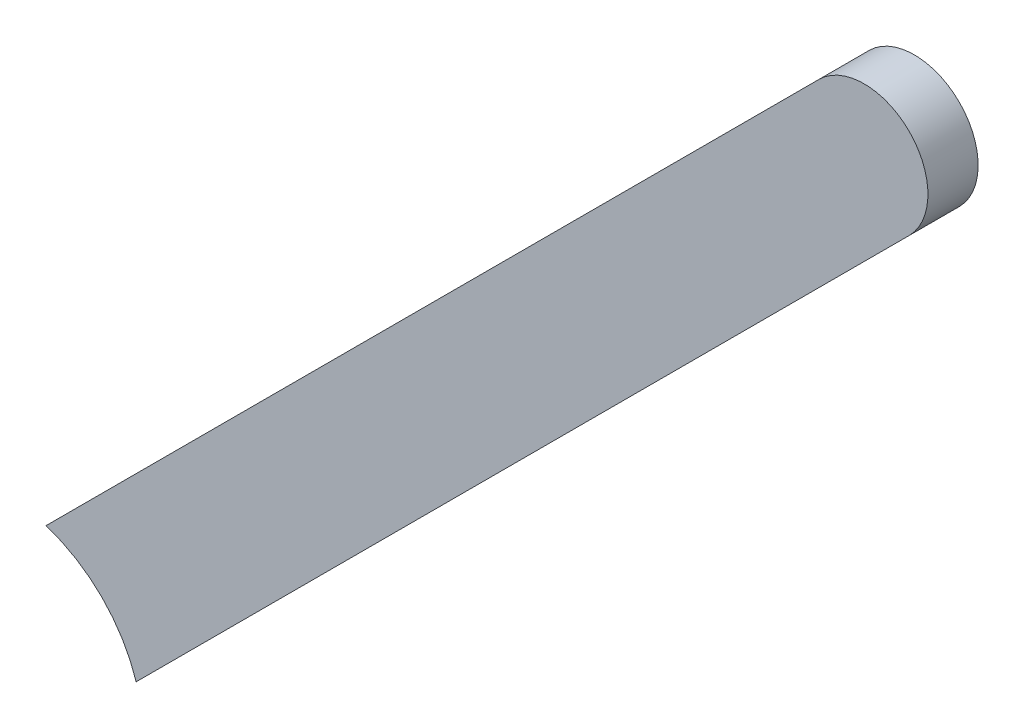
ISO-10303-21;
HEADER;
FILE_DESCRIPTION(('STEP AP214'),'2;1');
FILE_NAME('part.step','',(''),(''),'','','');
FILE_SCHEMA(('AUTOMOTIVE_DESIGN { 1 0 10303 214 1 1 1 1 }'));
ENDSEC;
DATA;
#1=APPLICATION_CONTEXT('core data for automotive mechanical design processes');
#2=APPLICATION_PROTOCOL_DEFINITION('international standard','automotive_design',2000,#1);
#3=PRODUCT_CONTEXT('',#1,'mechanical');
#4=PRODUCT('Part','Part','',(#3));
#5=PRODUCT_RELATED_PRODUCT_CATEGORY('part','',(#4));
#6=PRODUCT_DEFINITION_FORMATION('','',#4);
#7=PRODUCT_DEFINITION_CONTEXT('part definition',#1,'design');
#8=PRODUCT_DEFINITION('design','',#6,#7);
#9=PRODUCT_DEFINITION_SHAPE('','',#8);
#10=(LENGTH_UNIT() NAMED_UNIT(*) SI_UNIT(.MILLI.,.METRE.));
#11=(NAMED_UNIT(*) PLANE_ANGLE_UNIT() SI_UNIT($,.RADIAN.));
#12=(NAMED_UNIT(*) SI_UNIT($,.STERADIAN.) SOLID_ANGLE_UNIT());
#13=UNCERTAINTY_MEASURE_WITH_UNIT(LENGTH_MEASURE(1.E-05),#10,'distance_accuracy_value','');
#14=(GEOMETRIC_REPRESENTATION_CONTEXT(3) GLOBAL_UNCERTAINTY_ASSIGNED_CONTEXT((#13)) GLOBAL_UNIT_ASSIGNED_CONTEXT((#10,
#11,#12)) REPRESENTATION_CONTEXT('',''));
#15=CARTESIAN_POINT('',(0.,0.,0.));
#16=DIRECTION('',(0.,0.,1.));
#17=DIRECTION('',(1.,0.,0.));
#18=AXIS2_PLACEMENT_3D('',#15,#16,#17);
#19=CARTESIAN_POINT('',(94.3815390211441,101.258329941144,0.));
#20=DIRECTION('',(-0.707106781186549,0.707106781186546,0.));
#21=DIRECTION('',(0.707106781186546,0.707106781186549,0.));
#22=AXIS2_PLACEMENT_3D('',#19,#20,#21);
#23=PLANE('',#22);
#24=DIRECTION('',(0.707106781186546,0.707106781186549,0.));
#25=VECTOR('',#24,1.);
#26=CARTESIAN_POINT('',(94.03260594,100.90939686,0.1999996));
#27=LINE('',#26,#25);
#28=CARTESIAN_POINT('',(94.3815390211441,101.258329941144,0.1999996));
#29=VERTEX_POINT('',#28);
#30=CARTESIAN_POINT('',(97.46160594,104.33839686,0.1999996));
#31=VERTEX_POINT('',#30);
#32=EDGE_CURVE('E11',#29,#31,#27,.T.);
#33=ORIENTED_EDGE('',*,*,#32,.F.);
#34=DIRECTION('',(0.,0.,1.));
#35=VECTOR('',#34,1.);
#36=CARTESIAN_POINT('',(94.3815390211441,101.258329941144,0.));
#37=LINE('',#36,#35);
#38=CARTESIAN_POINT('',(94.3815390211441,101.258329941144,0.));
#39=VERTEX_POINT('',#38);
#40=EDGE_CURVE('E24',#39,#29,#37,.T.);
#41=ORIENTED_EDGE('',*,*,#40,.F.);
#42=DIRECTION('',(0.707106781186546,0.707106781186549,0.));
#43=VECTOR('',#42,1.);
#44=CARTESIAN_POINT('',(94.03260594,100.90939686,0.));
#45=LINE('',#44,#43);
#46=CARTESIAN_POINT('',(97.46160594,104.33839686,0.));
#47=VERTEX_POINT('',#46);
#48=EDGE_CURVE('E75',#39,#47,#45,.T.);
#49=ORIENTED_EDGE('',*,*,#48,.T.);
#50=DIRECTION('',(0.,0.,1.));
#51=VECTOR('',#50,1.);
#52=CARTESIAN_POINT('',(97.46160594,104.33839686,0.));
#53=LINE('',#52,#51);
#54=EDGE_CURVE('E37',#47,#31,#53,.T.);
#55=ORIENTED_EDGE('',*,*,#54,.T.);
#56=EDGE_LOOP('',(#33,#41,#49,#55));
#57=FACE_BOUND('',#56,.T.);
#58=ADVANCED_FACE('F17',(#57),#23,.F.);
#59=CARTESIAN_POINT('',(97.282,104.5180028,0.));
#60=DIRECTION('',(0.,0.,-1.));
#61=DIRECTION('',(0.707106781186548,-0.707106781186548,0.));
#62=AXIS2_PLACEMENT_3D('',#59,#60,#61);
#63=CYLINDRICAL_SURFACE('',#62,0.254001156230768);
#64=CARTESIAN_POINT('',(97.282,104.5180028,0.1999996));
#65=DIRECTION('',(0.,0.,1.));
#66=DIRECTION('',(0.707106781186548,-0.707106781186548,0.));
#67=AXIS2_PLACEMENT_3D('',#64,#65,#66);
#68=CIRCLE('',#67,0.254001156230768);
#69=CARTESIAN_POINT('',(97.10239406,104.69760874,0.1999996));
#70=VERTEX_POINT('',#69);
#71=EDGE_CURVE('E83',#31,#70,#68,.T.);
#72=ORIENTED_EDGE('',*,*,#71,.F.);
#73=ORIENTED_EDGE('',*,*,#54,.F.);
#74=CARTESIAN_POINT('',(97.282,104.5180028,0.));
#75=DIRECTION('',(0.,0.,1.));
#76=DIRECTION('',(0.707106781186548,-0.707106781186548,0.));
#77=AXIS2_PLACEMENT_3D('',#74,#75,#76);
#78=CIRCLE('',#77,0.254001156230768);
#79=CARTESIAN_POINT('',(97.10239406,104.69760874,0.));
#80=VERTEX_POINT('',#79);
#81=EDGE_CURVE('E81',#47,#80,#78,.T.);
#82=ORIENTED_EDGE('',*,*,#81,.T.);
#83=DIRECTION('',(0.,0.,1.));
#84=VECTOR('',#83,1.);
#85=CARTESIAN_POINT('',(97.10239406,104.69760874,0.));
#86=LINE('',#85,#84);
#87=EDGE_CURVE('E67',#80,#70,#86,.T.);
#88=ORIENTED_EDGE('',*,*,#87,.T.);
#89=EDGE_LOOP('',(#72,#73,#82,#88));
#90=FACE_BOUND('',#89,.T.);
#91=ADVANCED_FACE('F89',(#90),#63,.T.);
#92=CARTESIAN_POINT('',(97.10239406,104.69760874,0.));
#93=DIRECTION('',(0.707106781186548,-0.707106781186548,0.));
#94=DIRECTION('',(-0.707106781186548,-0.707106781186548,0.));
#95=AXIS2_PLACEMENT_3D('',#92,#93,#94);
#96=PLANE('',#95);
#97=DIRECTION('',(-0.707106781186548,-0.707106781186548,0.));
#98=VECTOR('',#97,1.);
#99=CARTESIAN_POINT('',(97.10239406,104.69760874,0.1999996));
#100=LINE('',#99,#98);
#101=CARTESIAN_POINT('',(94.0223271411441,101.617541821144,0.1999996));
#102=VERTEX_POINT('',#101);
#103=EDGE_CURVE('E71',#70,#102,#100,.T.);
#104=ORIENTED_EDGE('',*,*,#103,.F.);
#105=ORIENTED_EDGE('',*,*,#87,.F.);
#106=DIRECTION('',(-0.707106781186548,-0.707106781186548,0.));
#107=VECTOR('',#106,1.);
#108=CARTESIAN_POINT('',(97.10239406,104.69760874,0.));
#109=LINE('',#108,#107);
#110=CARTESIAN_POINT('',(94.0223271411441,101.617541821144,0.));
#111=VERTEX_POINT('',#110);
#112=EDGE_CURVE('E63',#80,#111,#109,.T.);
#113=ORIENTED_EDGE('',*,*,#112,.T.);
#114=DIRECTION('',(0.,0.,1.));
#115=VECTOR('',#114,1.);
#116=CARTESIAN_POINT('',(94.0223271411441,101.617541821144,0.));
#117=LINE('',#116,#115);
#118=EDGE_CURVE('E53',#111,#102,#117,.T.);
#119=ORIENTED_EDGE('',*,*,#118,.T.);
#120=EDGE_LOOP('',(#104,#105,#113,#119));
#121=FACE_BOUND('',#120,.T.);
#122=ADVANCED_FACE('F66',(#121),#96,.F.);
#123=CARTESIAN_POINT('',(93.853,101.0890028,0.));
#124=DIRECTION('',(0.,0.,-1.));
#125=DIRECTION('',(1.,0.,0.));
#126=AXIS2_PLACEMENT_3D('',#123,#124,#125);
#127=CYLINDRICAL_SURFACE('',#126,0.55500016);
#128=ORIENTED_EDGE('',*,*,#40,.T.);
#129=CARTESIAN_POINT('',(93.853,101.0890028,0.1999996));
#130=DIRECTION('',(0.,0.,1.));
#131=DIRECTION('',(1.,0.,0.));
#132=AXIS2_PLACEMENT_3D('',#129,#130,#131);
#133=CIRCLE('',#132,0.55500016);
#134=EDGE_CURVE('E59',#29,#102,#133,.T.);
#135=ORIENTED_EDGE('',*,*,#134,.T.);
#136=ORIENTED_EDGE('',*,*,#118,.F.);
#137=CARTESIAN_POINT('',(93.853,101.0890028,0.));
#138=DIRECTION('',(0.,0.,1.));
#139=DIRECTION('',(1.,0.,0.));
#140=AXIS2_PLACEMENT_3D('',#137,#138,#139);
#141=CIRCLE('',#140,0.55500016);
#142=EDGE_CURVE('E57',#39,#111,#141,.T.);
#143=ORIENTED_EDGE('',*,*,#142,.F.);
#144=EDGE_LOOP('',(#128,#135,#136,#143));
#145=FACE_BOUND('',#144,.T.);
#146=ADVANCED_FACE('F55',(#145),#127,.F.);
#147=CARTESIAN_POINT('',(94.03260594,100.90939686,0.));
#148=DIRECTION('',(0.,0.,-1.));
#149=DIRECTION('',(-1.,0.,0.));
#150=AXIS2_PLACEMENT_3D('',#147,#148,#149);
#151=PLANE('',#150);
#152=ORIENTED_EDGE('',*,*,#48,.F.);
#153=ORIENTED_EDGE('',*,*,#142,.T.);
#154=ORIENTED_EDGE('',*,*,#112,.F.);
#155=ORIENTED_EDGE('',*,*,#81,.F.);
#156=EDGE_LOOP('',(#152,#153,#154,#155));
#157=FACE_BOUND('',#156,.T.);
#158=ADVANCED_FACE('F74',(#157),#151,.T.);
#159=CARTESIAN_POINT('',(94.03260594,100.90939686,0.1999996));
#160=DIRECTION('',(0.,0.,-1.));
#161=DIRECTION('',(-1.,0.,0.));
#162=AXIS2_PLACEMENT_3D('',#159,#160,#161);
#163=PLANE('',#162);
#164=ORIENTED_EDGE('',*,*,#134,.F.);
#165=ORIENTED_EDGE('',*,*,#32,.T.);
#166=ORIENTED_EDGE('',*,*,#71,.T.);
#167=ORIENTED_EDGE('',*,*,#103,.T.);
#168=EDGE_LOOP('',(#164,#165,#166,#167));
#169=FACE_BOUND('',#168,.T.);
#170=ADVANCED_FACE('F91',(#169),#163,.F.);
#171=CLOSED_SHELL('',(#58,#91,#122,#146,#158,#170));
#172=MANIFOLD_SOLID_BREP('B1',#171);
#173=ADVANCED_BREP_SHAPE_REPRESENTATION('',(#18,#172),#14);
#174=SHAPE_DEFINITION_REPRESENTATION(#9,#173);
ENDSEC;
END-ISO-10303-21;
